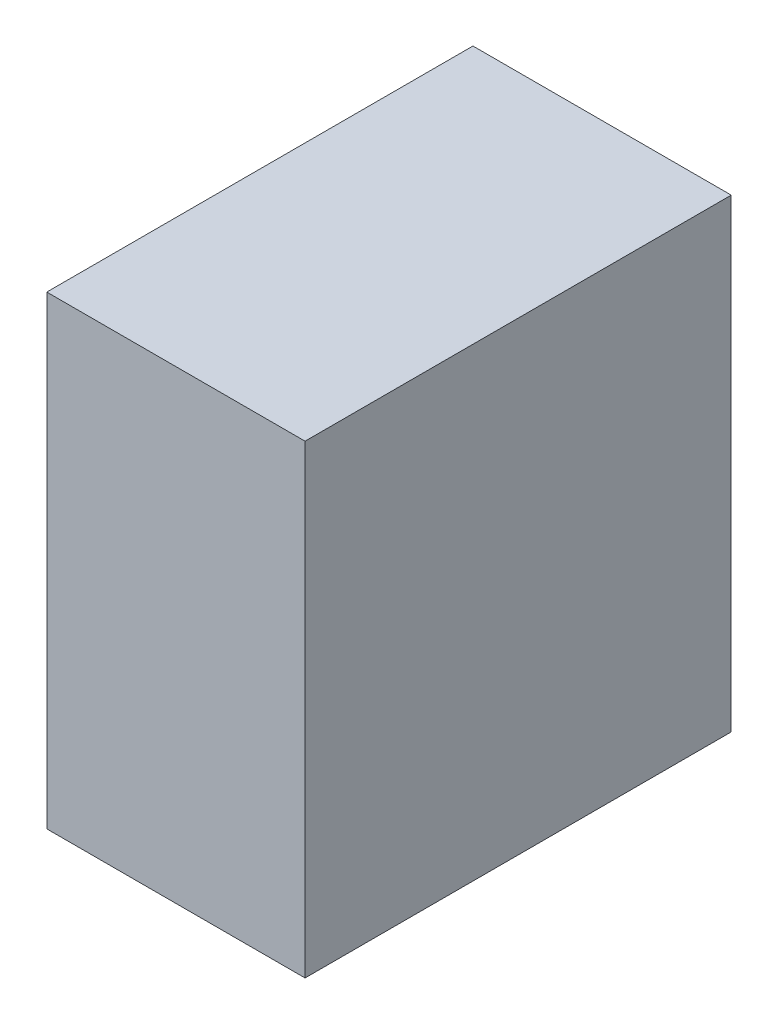
ISO-10303-21;
HEADER;
FILE_DESCRIPTION(('STEP AP214'),'2;1');
FILE_NAME('part.step','',(''),(''),'','','');
FILE_SCHEMA(('AUTOMOTIVE_DESIGN { 1 0 10303 214 1 1 1 1 }'));
ENDSEC;
DATA;
#1=APPLICATION_CONTEXT('core data for automotive mechanical design processes');
#2=APPLICATION_PROTOCOL_DEFINITION('international standard','automotive_design',2000,#1);
#3=PRODUCT_CONTEXT('',#1,'mechanical');
#4=PRODUCT('Part','Part','',(#3));
#5=PRODUCT_RELATED_PRODUCT_CATEGORY('part','',(#4));
#6=PRODUCT_DEFINITION_FORMATION('','',#4);
#7=PRODUCT_DEFINITION_CONTEXT('part definition',#1,'design');
#8=PRODUCT_DEFINITION('design','',#6,#7);
#9=PRODUCT_DEFINITION_SHAPE('','',#8);
#10=(LENGTH_UNIT() NAMED_UNIT(*) SI_UNIT(.MILLI.,.METRE.));
#11=(NAMED_UNIT(*) PLANE_ANGLE_UNIT() SI_UNIT($,.RADIAN.));
#12=(NAMED_UNIT(*) SI_UNIT($,.STERADIAN.) SOLID_ANGLE_UNIT());
#13=UNCERTAINTY_MEASURE_WITH_UNIT(LENGTH_MEASURE(1.E-05),#10,'distance_accuracy_value','');
#14=(GEOMETRIC_REPRESENTATION_CONTEXT(3) GLOBAL_UNCERTAINTY_ASSIGNED_CONTEXT((#13)) GLOBAL_UNIT_ASSIGNED_CONTEXT((#10,
#11,#12)) REPRESENTATION_CONTEXT('',''));
#15=CARTESIAN_POINT('',(0.,0.,0.));
#16=DIRECTION('',(0.,0.,1.));
#17=DIRECTION('',(1.,0.,0.));
#18=AXIS2_PLACEMENT_3D('',#15,#16,#17);
#19=CARTESIAN_POINT('',(-8.5,35.,15.));
#20=DIRECTION('',(0.,0.,-1.));
#21=DIRECTION('',(-1.,0.,0.));
#22=AXIS2_PLACEMENT_3D('',#19,#20,#21);
#23=PLANE('',#22);
#24=DIRECTION('',(0.,-1.,0.));
#25=VECTOR('',#24,1.);
#26=CARTESIAN_POINT('',(-3.5,37.5,15.));
#27=LINE('',#26,#25);
#28=CARTESIAN_POINT('',(-3.5,35.,15.));
#29=VERTEX_POINT('',#28);
#30=CARTESIAN_POINT('',(-3.5,0.,15.));
#31=VERTEX_POINT('',#30);
#32=EDGE_CURVE('E206',#29,#31,#27,.T.);
#33=ORIENTED_EDGE('',*,*,#32,.T.);
#34=DIRECTION('',(1.,0.,0.));
#35=VECTOR('',#34,1.);
#36=CARTESIAN_POINT('',(-8.5,0.,15.));
#37=LINE('',#36,#35);
#38=CARTESIAN_POINT('',(-8.5,0.,15.));
#39=VERTEX_POINT('',#38);
#40=EDGE_CURVE('E313',#39,#31,#37,.T.);
#41=ORIENTED_EDGE('',*,*,#40,.F.);
#42=DIRECTION('',(0.,-1.,0.));
#43=VECTOR('',#42,1.);
#44=CARTESIAN_POINT('',(-8.5,35.,15.));
#45=LINE('',#44,#43);
#46=CARTESIAN_POINT('',(-8.5,35.,15.));
#47=VERTEX_POINT('',#46);
#48=EDGE_CURVE('E341',#47,#39,#45,.T.);
#49=ORIENTED_EDGE('',*,*,#48,.F.);
#50=DIRECTION('',(1.,0.,0.));
#51=VECTOR('',#50,1.);
#52=CARTESIAN_POINT('',(-8.5,35.,15.));
#53=LINE('',#52,#51);
#54=EDGE_CURVE('E322',#47,#29,#53,.T.);
#55=ORIENTED_EDGE('',*,*,#54,.T.);
#56=EDGE_LOOP('',(#33,#41,#49,#55));
#57=FACE_BOUND('',#56,.T.);
#58=ADVANCED_FACE('F33',(#57),#23,.T.);
#59=DIRECTION('',(0.,-1.,0.));
#60=VECTOR('',#59,1.);
#61=CARTESIAN_POINT('',(3.50000000000001,37.5,15.));
#62=LINE('',#61,#60);
#63=CARTESIAN_POINT('',(3.50000000000001,35.,15.));
#64=VERTEX_POINT('',#63);
#65=CARTESIAN_POINT('',(3.50000000000001,0.,15.));
#66=VERTEX_POINT('',#65);
#67=EDGE_CURVE('E241',#64,#66,#62,.T.);
#68=ORIENTED_EDGE('',*,*,#67,.F.);
#69=CARTESIAN_POINT('',(8.5,35.,15.));
#70=VERTEX_POINT('',#69);
#71=EDGE_CURVE('E321',#64,#70,#53,.T.);
#72=ORIENTED_EDGE('',*,*,#71,.T.);
#73=DIRECTION('',(0.,-1.,0.));
#74=VECTOR('',#73,1.);
#75=CARTESIAN_POINT('',(8.5,35.,15.));
#76=LINE('',#75,#74);
#77=CARTESIAN_POINT('',(8.5,0.,15.));
#78=VERTEX_POINT('',#77);
#79=EDGE_CURVE('E324',#70,#78,#76,.T.);
#80=ORIENTED_EDGE('',*,*,#79,.T.);
#81=EDGE_CURVE('E335',#66,#78,#37,.T.);
#82=ORIENTED_EDGE('',*,*,#81,.F.);
#83=EDGE_LOOP('',(#68,#72,#80,#82));
#84=FACE_BOUND('',#83,.T.);
#85=ADVANCED_FACE('F390',(#84),#23,.T.);
#86=CARTESIAN_POINT('',(-8.5,35.,-15.));
#87=DIRECTION('',(0.,0.,1.));
#88=DIRECTION('',(1.,0.,0.));
#89=AXIS2_PLACEMENT_3D('',#86,#87,#88);
#90=PLANE('',#89);
#91=DIRECTION('',(0.,-1.,0.));
#92=VECTOR('',#91,1.);
#93=CARTESIAN_POINT('',(3.50000000000001,37.5,-15.));
#94=LINE('',#93,#92);
#95=CARTESIAN_POINT('',(3.50000000000001,35.,-15.));
#96=VERTEX_POINT('',#95);
#97=CARTESIAN_POINT('',(3.50000000000001,0.,-15.));
#98=VERTEX_POINT('',#97);
#99=EDGE_CURVE('E266',#96,#98,#94,.T.);
#100=ORIENTED_EDGE('',*,*,#99,.T.);
#101=DIRECTION('',(-1.,0.,0.));
#102=VECTOR('',#101,1.);
#103=CARTESIAN_POINT('',(-8.5,0.,-15.));
#104=LINE('',#103,#102);
#105=CARTESIAN_POINT('',(8.5,0.,-15.));
#106=VERTEX_POINT('',#105);
#107=EDGE_CURVE('E328',#106,#98,#104,.T.);
#108=ORIENTED_EDGE('',*,*,#107,.F.);
#109=DIRECTION('',(0.,-1.,0.));
#110=VECTOR('',#109,1.);
#111=CARTESIAN_POINT('',(8.5,35.,-15.));
#112=LINE('',#111,#110);
#113=CARTESIAN_POINT('',(8.5,35.,-15.));
#114=VERTEX_POINT('',#113);
#115=EDGE_CURVE('E346',#114,#106,#112,.T.);
#116=ORIENTED_EDGE('',*,*,#115,.F.);
#117=DIRECTION('',(-1.,0.,0.));
#118=VECTOR('',#117,1.);
#119=CARTESIAN_POINT('',(-8.5,35.,-15.));
#120=LINE('',#119,#118);
#121=EDGE_CURVE('E314',#114,#96,#120,.T.);
#122=ORIENTED_EDGE('',*,*,#121,.T.);
#123=EDGE_LOOP('',(#100,#108,#116,#122));
#124=FACE_BOUND('',#123,.T.);
#125=ADVANCED_FACE('F397',(#124),#90,.T.);
#126=DIRECTION('',(0.,-1.,0.));
#127=VECTOR('',#126,1.);
#128=CARTESIAN_POINT('',(-3.5,37.5,-15.));
#129=LINE('',#128,#127);
#130=CARTESIAN_POINT('',(-3.5,35.,-15.));
#131=VERTEX_POINT('',#130);
#132=CARTESIAN_POINT('',(-3.5,0.,-15.));
#133=VERTEX_POINT('',#132);
#134=EDGE_CURVE('E290',#131,#133,#129,.T.);
#135=ORIENTED_EDGE('',*,*,#134,.F.);
#136=CARTESIAN_POINT('',(-8.5,35.,-15.));
#137=VERTEX_POINT('',#136);
#138=EDGE_CURVE('E312',#131,#137,#120,.T.);
#139=ORIENTED_EDGE('',*,*,#138,.T.);
#140=DIRECTION('',(0.,-1.,0.));
#141=VECTOR('',#140,1.);
#142=CARTESIAN_POINT('',(-8.5,35.,-15.));
#143=LINE('',#142,#141);
#144=CARTESIAN_POINT('',(-8.5,0.,-15.));
#145=VERTEX_POINT('',#144);
#146=EDGE_CURVE('E343',#137,#145,#143,.T.);
#147=ORIENTED_EDGE('',*,*,#146,.T.);
#148=EDGE_CURVE('E327',#133,#145,#104,.T.);
#149=ORIENTED_EDGE('',*,*,#148,.F.);
#150=EDGE_LOOP('',(#135,#139,#147,#149));
#151=FACE_BOUND('',#150,.T.);
#152=ADVANCED_FACE('F556',(#151),#90,.T.);
#153=CARTESIAN_POINT('',(0.,0.,0.));
#154=DIRECTION('',(0.,1.,0.));
#155=DIRECTION('',(0.,0.,1.));
#156=AXIS2_PLACEMENT_3D('',#153,#154,#155);
#157=PLANE('',#156);
#158=DIRECTION('',(1.,0.,0.));
#159=VECTOR('',#158,1.);
#160=CARTESIAN_POINT('',(-10.,0.,16.5));
#161=LINE('',#160,#159);
#162=CARTESIAN_POINT('',(-10.,0.,16.5));
#163=VERTEX_POINT('',#162);
#164=CARTESIAN_POINT('',(10.,0.,16.5));
#165=VERTEX_POINT('',#164);
#166=EDGE_CURVE('E349',#163,#165,#161,.T.);
#167=ORIENTED_EDGE('',*,*,#166,.F.);
#168=DIRECTION('',(0.,0.,1.));
#169=VECTOR('',#168,1.);
#170=CARTESIAN_POINT('',(-10.,0.,16.5));
#171=LINE('',#170,#169);
#172=CARTESIAN_POINT('',(-9.99999999999999,0.,-16.5));
#173=VERTEX_POINT('',#172);
#174=EDGE_CURVE('E356',#173,#163,#171,.T.);
#175=ORIENTED_EDGE('',*,*,#174,.F.);
#176=DIRECTION('',(-1.,0.,0.));
#177=VECTOR('',#176,1.);
#178=CARTESIAN_POINT('',(-9.99999999999999,0.,-16.5));
#179=LINE('',#178,#177);
#180=CARTESIAN_POINT('',(10.,0.,-16.5));
#181=VERTEX_POINT('',#180);
#182=EDGE_CURVE('E354',#181,#173,#179,.T.);
#183=ORIENTED_EDGE('',*,*,#182,.F.);
#184=DIRECTION('',(0.,0.,-1.));
#185=VECTOR('',#184,1.);
#186=CARTESIAN_POINT('',(10.,0.,16.5));
#187=LINE('',#186,#185);
#188=EDGE_CURVE('E352',#165,#181,#187,.T.);
#189=ORIENTED_EDGE('',*,*,#188,.F.);
#190=EDGE_LOOP('',(#167,#175,#183,#189));
#191=FACE_BOUND('',#190,.T.);
#192=DIRECTION('',(0.,0.,-1.));
#193=VECTOR('',#192,1.);
#194=CARTESIAN_POINT('',(8.5,0.,15.));
#195=LINE('',#194,#193);
#196=EDGE_CURVE('E308',#78,#106,#195,.T.);
#197=ORIENTED_EDGE('',*,*,#196,.T.);
#198=ORIENTED_EDGE('',*,*,#107,.T.);
#199=DIRECTION('',(0.,0.,1.));
#200=VECTOR('',#199,1.);
#201=CARTESIAN_POINT('',(3.50000000000001,0.,-15.));
#202=LINE('',#201,#200);
#203=CARTESIAN_POINT('',(3.50000000000001,0.,-13.));
#204=VERTEX_POINT('',#203);
#205=EDGE_CURVE('E246',#98,#204,#202,.T.);
#206=ORIENTED_EDGE('',*,*,#205,.T.);
#207=DIRECTION('',(-1.,0.,0.));
#208=VECTOR('',#207,1.);
#209=CARTESIAN_POINT('',(2.00000000000001,0.,-13.));
#210=LINE('',#209,#208);
#211=CARTESIAN_POINT('',(2.00000000000001,0.,-13.));
#212=VERTEX_POINT('',#211);
#213=EDGE_CURVE('E251',#204,#212,#210,.T.);
#214=ORIENTED_EDGE('',*,*,#213,.T.);
#215=DIRECTION('',(0.,0.,-1.));
#216=VECTOR('',#215,1.);
#217=CARTESIAN_POINT('',(2.00000000000001,0.,-15.));
#218=LINE('',#217,#216);
#219=CARTESIAN_POINT('',(2.00000000000001,0.,-15.));
#220=VERTEX_POINT('',#219);
#221=EDGE_CURVE('E247',#212,#220,#218,.T.);
#222=ORIENTED_EDGE('',*,*,#221,.T.);
#223=CARTESIAN_POINT('',(-2.,0.,-15.));
#224=VERTEX_POINT('',#223);
#225=EDGE_CURVE('E332',#220,#224,#104,.T.);
#226=ORIENTED_EDGE('',*,*,#225,.T.);
#227=DIRECTION('',(0.,0.,1.));
#228=VECTOR('',#227,1.);
#229=CARTESIAN_POINT('',(-2.,0.,-15.));
#230=LINE('',#229,#228);
#231=CARTESIAN_POINT('',(-2.,0.,-13.));
#232=VERTEX_POINT('',#231);
#233=EDGE_CURVE('E271',#224,#232,#230,.T.);
#234=ORIENTED_EDGE('',*,*,#233,.T.);
#235=DIRECTION('',(-1.,0.,0.));
#236=VECTOR('',#235,1.);
#237=CARTESIAN_POINT('',(-2.,0.,-13.));
#238=LINE('',#237,#236);
#239=CARTESIAN_POINT('',(-3.5,0.,-13.));
#240=VERTEX_POINT('',#239);
#241=EDGE_CURVE('E276',#232,#240,#238,.T.);
#242=ORIENTED_EDGE('',*,*,#241,.T.);
#243=DIRECTION('',(0.,0.,-1.));
#244=VECTOR('',#243,1.);
#245=CARTESIAN_POINT('',(-3.5,0.,-15.));
#246=LINE('',#245,#244);
#247=EDGE_CURVE('E272',#240,#133,#246,.T.);
#248=ORIENTED_EDGE('',*,*,#247,.T.);
#249=ORIENTED_EDGE('',*,*,#148,.T.);
#250=DIRECTION('',(0.,0.,1.));
#251=VECTOR('',#250,1.);
#252=CARTESIAN_POINT('',(-8.5,0.,15.));
#253=LINE('',#252,#251);
#254=EDGE_CURVE('E331',#145,#39,#253,.T.);
#255=ORIENTED_EDGE('',*,*,#254,.T.);
#256=ORIENTED_EDGE('',*,*,#40,.T.);
#257=DIRECTION('',(0.,0.,-1.));
#258=VECTOR('',#257,1.);
#259=CARTESIAN_POINT('',(-3.5,0.,15.));
#260=LINE('',#259,#258);
#261=CARTESIAN_POINT('',(-3.5,0.,13.));
#262=VERTEX_POINT('',#261);
#263=EDGE_CURVE('E542',#31,#262,#260,.T.);
#264=ORIENTED_EDGE('',*,*,#263,.T.);
#265=DIRECTION('',(1.,0.,0.));
#266=VECTOR('',#265,1.);
#267=CARTESIAN_POINT('',(-2.,0.,13.));
#268=LINE('',#267,#266);
#269=CARTESIAN_POINT('',(-2.,0.,13.));
#270=VERTEX_POINT('',#269);
#271=EDGE_CURVE('E198',#262,#270,#268,.T.);
#272=ORIENTED_EDGE('',*,*,#271,.T.);
#273=DIRECTION('',(0.,0.,1.));
#274=VECTOR('',#273,1.);
#275=CARTESIAN_POINT('',(-2.,0.,15.));
#276=LINE('',#275,#274);
#277=CARTESIAN_POINT('',(-2.,0.,15.));
#278=VERTEX_POINT('',#277);
#279=EDGE_CURVE('E209',#270,#278,#276,.T.);
#280=ORIENTED_EDGE('',*,*,#279,.T.);
#281=CARTESIAN_POINT('',(2.00000000000001,0.,15.));
#282=VERTEX_POINT('',#281);
#283=EDGE_CURVE('E338',#278,#282,#37,.T.);
#284=ORIENTED_EDGE('',*,*,#283,.T.);
#285=DIRECTION('',(0.,0.,-1.));
#286=VECTOR('',#285,1.);
#287=CARTESIAN_POINT('',(2.00000000000001,0.,15.));
#288=LINE('',#287,#286);
#289=CARTESIAN_POINT('',(2.00000000000001,0.,13.));
#290=VERTEX_POINT('',#289);
#291=EDGE_CURVE('E222',#282,#290,#288,.T.);
#292=ORIENTED_EDGE('',*,*,#291,.T.);
#293=DIRECTION('',(1.,0.,0.));
#294=VECTOR('',#293,1.);
#295=CARTESIAN_POINT('',(2.00000000000001,0.,13.));
#296=LINE('',#295,#294);
#297=CARTESIAN_POINT('',(3.50000000000001,0.,13.));
#298=VERTEX_POINT('',#297);
#299=EDGE_CURVE('E227',#290,#298,#296,.T.);
#300=ORIENTED_EDGE('',*,*,#299,.T.);
#301=DIRECTION('',(0.,0.,1.));
#302=VECTOR('',#301,1.);
#303=CARTESIAN_POINT('',(3.50000000000001,0.,15.));
#304=LINE('',#303,#302);
#305=EDGE_CURVE('E223',#298,#66,#304,.T.);
#306=ORIENTED_EDGE('',*,*,#305,.T.);
#307=ORIENTED_EDGE('',*,*,#81,.T.);
#308=EDGE_LOOP('',(#197,#198,#206,#214,#222,#226,#234,#242,#248,#249,#255,#256,#264,#272,#280,
#284,#292,#300,#306,#307));
#309=FACE_BOUND('',#308,.T.);
#310=ADVANCED_FACE('F373',(#191,#309),#157,.F.);
#311=CARTESIAN_POINT('',(-10.,35.,16.5));
#312=DIRECTION('',(0.,0.,-1.));
#313=DIRECTION('',(-1.,0.,0.));
#314=AXIS2_PLACEMENT_3D('',#311,#312,#313);
#315=PLANE('',#314);
#316=ORIENTED_EDGE('',*,*,#166,.T.);
#317=DIRECTION('',(0.,-1.,0.));
#318=VECTOR('',#317,1.);
#319=CARTESIAN_POINT('',(10.,35.,16.5));
#320=LINE('',#319,#318);
#321=CARTESIAN_POINT('',(10.,36.,16.5));
#322=VERTEX_POINT('',#321);
#323=EDGE_CURVE('E11',#322,#165,#320,.T.);
#324=ORIENTED_EDGE('',*,*,#323,.F.);
#325=DIRECTION('',(1.,0.,0.));
#326=VECTOR('',#325,1.);
#327=CARTESIAN_POINT('',(-10.,36.,16.5));
#328=LINE('',#327,#326);
#329=CARTESIAN_POINT('',(-10.,36.,16.5));
#330=VERTEX_POINT('',#329);
#331=EDGE_CURVE('E299',#330,#322,#328,.T.);
#332=ORIENTED_EDGE('',*,*,#331,.F.);
#333=DIRECTION('',(0.,-1.,0.));
#334=VECTOR('',#333,1.);
#335=CARTESIAN_POINT('',(-10.,35.,16.5));
#336=LINE('',#335,#334);
#337=EDGE_CURVE('E358',#330,#163,#336,.T.);
#338=ORIENTED_EDGE('',*,*,#337,.T.);
#339=EDGE_LOOP('',(#316,#324,#332,#338));
#340=FACE_BOUND('',#339,.T.);
#341=ADVANCED_FACE('F35',(#340),#315,.F.);
#342=CARTESIAN_POINT('',(10.,35.,16.5));
#343=DIRECTION('',(-1.,0.,0.));
#344=DIRECTION('',(0.,0.,1.));
#345=AXIS2_PLACEMENT_3D('',#342,#343,#344);
#346=PLANE('',#345);
#347=ORIENTED_EDGE('',*,*,#188,.T.);
#348=DIRECTION('',(0.,-1.,0.));
#349=VECTOR('',#348,1.);
#350=CARTESIAN_POINT('',(10.,35.,-16.5));
#351=LINE('',#350,#349);
#352=CARTESIAN_POINT('',(10.,36.,-16.5));
#353=VERTEX_POINT('',#352);
#354=EDGE_CURVE('E41',#353,#181,#351,.T.);
#355=ORIENTED_EDGE('',*,*,#354,.F.);
#356=DIRECTION('',(0.,0.,-1.));
#357=VECTOR('',#356,1.);
#358=CARTESIAN_POINT('',(10.,36.,16.5));
#359=LINE('',#358,#357);
#360=EDGE_CURVE('E302',#322,#353,#359,.T.);
#361=ORIENTED_EDGE('',*,*,#360,.F.);
#362=ORIENTED_EDGE('',*,*,#323,.T.);
#363=EDGE_LOOP('',(#347,#355,#361,#362));
#364=FACE_BOUND('',#363,.T.);
#365=ADVANCED_FACE('F382',(#364),#346,.F.);
#366=CARTESIAN_POINT('',(-9.99999999999999,35.,-16.5));
#367=DIRECTION('',(0.,0.,1.));
#368=DIRECTION('',(1.,0.,0.));
#369=AXIS2_PLACEMENT_3D('',#366,#367,#368);
#370=PLANE('',#369);
#371=ORIENTED_EDGE('',*,*,#182,.T.);
#372=DIRECTION('',(0.,-1.,0.));
#373=VECTOR('',#372,1.);
#374=CARTESIAN_POINT('',(-9.99999999999999,35.,-16.5));
#375=LINE('',#374,#373);
#376=CARTESIAN_POINT('',(-9.99999999999999,36.,-16.5));
#377=VERTEX_POINT('',#376);
#378=EDGE_CURVE('E361',#377,#173,#375,.T.);
#379=ORIENTED_EDGE('',*,*,#378,.F.);
#380=DIRECTION('',(-1.,0.,0.));
#381=VECTOR('',#380,1.);
#382=CARTESIAN_POINT('',(10.,36.,-16.5));
#383=LINE('',#382,#381);
#384=EDGE_CURVE('E305',#353,#377,#383,.T.);
#385=ORIENTED_EDGE('',*,*,#384,.F.);
#386=ORIENTED_EDGE('',*,*,#354,.T.);
#387=EDGE_LOOP('',(#371,#379,#385,#386));
#388=FACE_BOUND('',#387,.T.);
#389=ADVANCED_FACE('F367',(#388),#370,.F.);
#390=CARTESIAN_POINT('',(-10.,35.,16.5));
#391=DIRECTION('',(1.,0.,0.));
#392=DIRECTION('',(0.,0.,-1.));
#393=AXIS2_PLACEMENT_3D('',#390,#391,#392);
#394=PLANE('',#393);
#395=ORIENTED_EDGE('',*,*,#174,.T.);
#396=ORIENTED_EDGE('',*,*,#337,.F.);
#397=DIRECTION('',(0.,0.,1.));
#398=VECTOR('',#397,1.);
#399=CARTESIAN_POINT('',(-9.99999999999999,36.,-16.5));
#400=LINE('',#399,#398);
#401=EDGE_CURVE('E296',#377,#330,#400,.T.);
#402=ORIENTED_EDGE('',*,*,#401,.F.);
#403=ORIENTED_EDGE('',*,*,#378,.T.);
#404=EDGE_LOOP('',(#395,#396,#402,#403));
#405=FACE_BOUND('',#404,.T.);
#406=ADVANCED_FACE('F376',(#405),#394,.F.);
#407=CARTESIAN_POINT('',(8.5,35.,15.));
#408=DIRECTION('',(-1.,0.,0.));
#409=DIRECTION('',(0.,0.,1.));
#410=AXIS2_PLACEMENT_3D('',#407,#408,#409);
#411=PLANE('',#410);
#412=ORIENTED_EDGE('',*,*,#196,.F.);
#413=ORIENTED_EDGE('',*,*,#79,.F.);
#414=DIRECTION('',(0.,0.,-1.));
#415=VECTOR('',#414,1.);
#416=CARTESIAN_POINT('',(8.5,35.,15.));
#417=LINE('',#416,#415);
#418=EDGE_CURVE('E309',#70,#114,#417,.T.);
#419=ORIENTED_EDGE('',*,*,#418,.T.);
#420=ORIENTED_EDGE('',*,*,#115,.T.);
#421=EDGE_LOOP('',(#412,#413,#419,#420));
#422=FACE_BOUND('',#421,.T.);
#423=ADVANCED_FACE('F425',(#422),#411,.T.);
#424=DIRECTION('',(0.,-1.,0.));
#425=VECTOR('',#424,1.);
#426=CARTESIAN_POINT('',(2.00000000000001,37.5,-15.));
#427=LINE('',#426,#425);
#428=CARTESIAN_POINT('',(2.00000000000001,35.,-15.));
#429=VERTEX_POINT('',#428);
#430=EDGE_CURVE('E261',#429,#220,#427,.T.);
#431=ORIENTED_EDGE('',*,*,#430,.F.);
#432=CARTESIAN_POINT('',(-2.,35.,-15.));
#433=VERTEX_POINT('',#432);
#434=EDGE_CURVE('E318',#429,#433,#120,.T.);
#435=ORIENTED_EDGE('',*,*,#434,.T.);
#436=DIRECTION('',(0.,-1.,0.));
#437=VECTOR('',#436,1.);
#438=CARTESIAN_POINT('',(-2.,37.5,-15.));
#439=LINE('',#438,#437);
#440=EDGE_CURVE('E287',#433,#224,#439,.T.);
#441=ORIENTED_EDGE('',*,*,#440,.T.);
#442=ORIENTED_EDGE('',*,*,#225,.F.);
#443=EDGE_LOOP('',(#431,#435,#441,#442));
#444=FACE_BOUND('',#443,.T.);
#445=ADVANCED_FACE('F407',(#444),#90,.T.);
#446=CARTESIAN_POINT('',(-8.5,35.,15.));
#447=DIRECTION('',(1.,0.,0.));
#448=DIRECTION('',(0.,0.,-1.));
#449=AXIS2_PLACEMENT_3D('',#446,#447,#448);
#450=PLANE('',#449);
#451=ORIENTED_EDGE('',*,*,#254,.F.);
#452=ORIENTED_EDGE('',*,*,#146,.F.);
#453=DIRECTION('',(0.,0.,1.));
#454=VECTOR('',#453,1.);
#455=CARTESIAN_POINT('',(-8.5,35.,15.));
#456=LINE('',#455,#454);
#457=EDGE_CURVE('E317',#137,#47,#456,.T.);
#458=ORIENTED_EDGE('',*,*,#457,.T.);
#459=ORIENTED_EDGE('',*,*,#48,.T.);
#460=EDGE_LOOP('',(#451,#452,#458,#459));
#461=FACE_BOUND('',#460,.T.);
#462=ADVANCED_FACE('F402',(#461),#450,.T.);
#463=DIRECTION('',(0.,-1.,0.));
#464=VECTOR('',#463,1.);
#465=CARTESIAN_POINT('',(-2.,37.5,15.));
#466=LINE('',#465,#464);
#467=CARTESIAN_POINT('',(-2.,35.,15.));
#468=VERTEX_POINT('',#467);
#469=EDGE_CURVE('E219',#468,#278,#466,.T.);
#470=ORIENTED_EDGE('',*,*,#469,.F.);
#471=CARTESIAN_POINT('',(2.00000000000001,35.,15.));
#472=VERTEX_POINT('',#471);
#473=EDGE_CURVE('E56',#468,#472,#53,.T.);
#474=ORIENTED_EDGE('',*,*,#473,.T.);
#475=DIRECTION('',(0.,-1.,0.));
#476=VECTOR('',#475,1.);
#477=CARTESIAN_POINT('',(2.00000000000001,37.5,15.));
#478=LINE('',#477,#476);
#479=EDGE_CURVE('E238',#472,#282,#478,.T.);
#480=ORIENTED_EDGE('',*,*,#479,.T.);
#481=ORIENTED_EDGE('',*,*,#283,.F.);
#482=EDGE_LOOP('',(#470,#474,#480,#481));
#483=FACE_BOUND('',#482,.T.);
#484=ADVANCED_FACE('F393',(#483),#23,.T.);
#485=CARTESIAN_POINT('',(0.,35.,0.));
#486=DIRECTION('',(0.,1.,0.));
#487=DIRECTION('',(0.,0.,1.));
#488=AXIS2_PLACEMENT_3D('',#485,#486,#487);
#489=PLANE('',#488);
#490=DIRECTION('',(1.,0.,0.));
#491=VECTOR('',#490,1.);
#492=CARTESIAN_POINT('',(-2.,35.,13.));
#493=LINE('',#492,#491);
#494=CARTESIAN_POINT('',(-3.5,35.,13.));
#495=VERTEX_POINT('',#494);
#496=CARTESIAN_POINT('',(-2.,35.,13.));
#497=VERTEX_POINT('',#496);
#498=EDGE_CURVE('E48',#495,#497,#493,.T.);
#499=ORIENTED_EDGE('',*,*,#498,.F.);
#500=DIRECTION('',(0.,0.,-1.));
#501=VECTOR('',#500,1.);
#502=CARTESIAN_POINT('',(-3.5,35.,15.));
#503=LINE('',#502,#501);
#504=EDGE_CURVE('E201',#29,#495,#503,.T.);
#505=ORIENTED_EDGE('',*,*,#504,.F.);
#506=ORIENTED_EDGE('',*,*,#54,.F.);
#507=ORIENTED_EDGE('',*,*,#457,.F.);
#508=ORIENTED_EDGE('',*,*,#138,.F.);
#509=DIRECTION('',(0.,0.,-1.));
#510=VECTOR('',#509,1.);
#511=CARTESIAN_POINT('',(-3.5,35.,-15.));
#512=LINE('',#511,#510);
#513=CARTESIAN_POINT('',(-3.5,35.,-13.));
#514=VERTEX_POINT('',#513);
#515=EDGE_CURVE('E288',#514,#131,#512,.T.);
#516=ORIENTED_EDGE('',*,*,#515,.F.);
#517=DIRECTION('',(-1.,0.,0.));
#518=VECTOR('',#517,1.);
#519=CARTESIAN_POINT('',(-2.,35.,-13.));
#520=LINE('',#519,#518);
#521=CARTESIAN_POINT('',(-2.,35.,-13.));
#522=VERTEX_POINT('',#521);
#523=EDGE_CURVE('E275',#522,#514,#520,.T.);
#524=ORIENTED_EDGE('',*,*,#523,.F.);
#525=DIRECTION('',(0.,0.,1.));
#526=VECTOR('',#525,1.);
#527=CARTESIAN_POINT('',(-2.,35.,-15.));
#528=LINE('',#527,#526);
#529=EDGE_CURVE('E284',#433,#522,#528,.T.);
#530=ORIENTED_EDGE('',*,*,#529,.F.);
#531=ORIENTED_EDGE('',*,*,#434,.F.);
#532=DIRECTION('',(0.,0.,-1.));
#533=VECTOR('',#532,1.);
#534=CARTESIAN_POINT('',(2.00000000000001,35.,-15.));
#535=LINE('',#534,#533);
#536=CARTESIAN_POINT('',(2.00000000000001,35.,-13.));
#537=VERTEX_POINT('',#536);
#538=EDGE_CURVE('E259',#537,#429,#535,.T.);
#539=ORIENTED_EDGE('',*,*,#538,.F.);
#540=DIRECTION('',(-1.,0.,0.));
#541=VECTOR('',#540,1.);
#542=CARTESIAN_POINT('',(2.00000000000001,35.,-13.));
#543=LINE('',#542,#541);
#544=CARTESIAN_POINT('',(3.50000000000001,35.,-13.));
#545=VERTEX_POINT('',#544);
#546=EDGE_CURVE('E263',#545,#537,#543,.T.);
#547=ORIENTED_EDGE('',*,*,#546,.F.);
#548=DIRECTION('',(0.,0.,1.));
#549=VECTOR('',#548,1.);
#550=CARTESIAN_POINT('',(3.50000000000001,35.,-15.));
#551=LINE('',#550,#549);
#552=EDGE_CURVE('E250',#96,#545,#551,.T.);
#553=ORIENTED_EDGE('',*,*,#552,.F.);
#554=ORIENTED_EDGE('',*,*,#121,.F.);
#555=ORIENTED_EDGE('',*,*,#418,.F.);
#556=ORIENTED_EDGE('',*,*,#71,.F.);
#557=DIRECTION('',(0.,0.,1.));
#558=VECTOR('',#557,1.);
#559=CARTESIAN_POINT('',(3.50000000000001,35.,15.));
#560=LINE('',#559,#558);
#561=CARTESIAN_POINT('',(3.50000000000001,35.,13.));
#562=VERTEX_POINT('',#561);
#563=EDGE_CURVE('E239',#562,#64,#560,.T.);
#564=ORIENTED_EDGE('',*,*,#563,.F.);
#565=DIRECTION('',(1.,0.,0.));
#566=VECTOR('',#565,1.);
#567=CARTESIAN_POINT('',(2.00000000000001,35.,13.));
#568=LINE('',#567,#566);
#569=CARTESIAN_POINT('',(2.00000000000001,35.,13.));
#570=VERTEX_POINT('',#569);
#571=EDGE_CURVE('E226',#570,#562,#568,.T.);
#572=ORIENTED_EDGE('',*,*,#571,.F.);
#573=DIRECTION('',(0.,0.,-1.));
#574=VECTOR('',#573,1.);
#575=CARTESIAN_POINT('',(2.00000000000001,35.,15.));
#576=LINE('',#575,#574);
#577=EDGE_CURVE('E235',#472,#570,#576,.T.);
#578=ORIENTED_EDGE('',*,*,#577,.F.);
#579=ORIENTED_EDGE('',*,*,#473,.F.);
#580=DIRECTION('',(0.,0.,1.));
#581=VECTOR('',#580,1.);
#582=CARTESIAN_POINT('',(-2.,35.,15.));
#583=LINE('',#582,#581);
#584=EDGE_CURVE('E213',#497,#468,#583,.T.);
#585=ORIENTED_EDGE('',*,*,#584,.F.);
#586=EDGE_LOOP('',(#499,#505,#506,#507,#508,#516,#524,#530,#531,#539,#547,#553,#554,#555,#556,
#564,#572,#578,#579,#585));
#587=FACE_BOUND('',#586,.T.);
#588=ADVANCED_FACE('F212',(#587),#489,.F.);
#589=CARTESIAN_POINT('',(0.,36.,0.));
#590=DIRECTION('',(0.,1.,0.));
#591=DIRECTION('',(0.,0.,1.));
#592=AXIS2_PLACEMENT_3D('',#589,#590,#591);
#593=PLANE('',#592);
#594=ORIENTED_EDGE('',*,*,#401,.T.);
#595=ORIENTED_EDGE('',*,*,#331,.T.);
#596=ORIENTED_EDGE('',*,*,#360,.T.);
#597=ORIENTED_EDGE('',*,*,#384,.T.);
#598=EDGE_LOOP('',(#594,#595,#596,#597));
#599=FACE_BOUND('',#598,.T.);
#600=ADVANCED_FACE('F381',(#599),#593,.T.);
#601=CARTESIAN_POINT('',(-2.,37.5,-13.));
#602=DIRECTION('',(0.,0.,1.));
#603=DIRECTION('',(1.,0.,0.));
#604=AXIS2_PLACEMENT_3D('',#601,#602,#603);
#605=PLANE('',#604);
#606=DIRECTION('',(0.,-1.,0.));
#607=VECTOR('',#606,1.);
#608=CARTESIAN_POINT('',(-2.,37.5,-13.));
#609=LINE('',#608,#607);
#610=EDGE_CURVE('E286',#522,#232,#609,.T.);
#611=ORIENTED_EDGE('',*,*,#610,.F.);
#612=ORIENTED_EDGE('',*,*,#523,.T.);
#613=DIRECTION('',(0.,-1.,0.));
#614=VECTOR('',#613,1.);
#615=CARTESIAN_POINT('',(-3.5,37.5,-13.));
#616=LINE('',#615,#614);
#617=EDGE_CURVE('E283',#514,#240,#616,.T.);
#618=ORIENTED_EDGE('',*,*,#617,.T.);
#619=ORIENTED_EDGE('',*,*,#241,.F.);
#620=EDGE_LOOP('',(#611,#612,#618,#619));
#621=FACE_BOUND('',#620,.T.);
#622=ADVANCED_FACE('F465',(#621),#605,.T.);
#623=CARTESIAN_POINT('',(-3.5,37.5,-15.));
#624=DIRECTION('',(-1.,0.,0.));
#625=DIRECTION('',(0.,0.,1.));
#626=AXIS2_PLACEMENT_3D('',#623,#624,#625);
#627=PLANE('',#626);
#628=ORIENTED_EDGE('',*,*,#617,.F.);
#629=ORIENTED_EDGE('',*,*,#515,.T.);
#630=ORIENTED_EDGE('',*,*,#134,.T.);
#631=ORIENTED_EDGE('',*,*,#247,.F.);
#632=EDGE_LOOP('',(#628,#629,#630,#631));
#633=FACE_BOUND('',#632,.T.);
#634=ADVANCED_FACE('F461',(#633),#627,.T.);
#635=CARTESIAN_POINT('',(-2.,37.5,-15.));
#636=DIRECTION('',(1.,0.,0.));
#637=DIRECTION('',(0.,0.,-1.));
#638=AXIS2_PLACEMENT_3D('',#635,#636,#637);
#639=PLANE('',#638);
#640=ORIENTED_EDGE('',*,*,#440,.F.);
#641=ORIENTED_EDGE('',*,*,#529,.T.);
#642=ORIENTED_EDGE('',*,*,#610,.T.);
#643=ORIENTED_EDGE('',*,*,#233,.F.);
#644=EDGE_LOOP('',(#640,#641,#642,#643));
#645=FACE_BOUND('',#644,.T.);
#646=ADVANCED_FACE('F457',(#645),#639,.T.);
#647=CARTESIAN_POINT('',(3.50000000000001,37.5,-15.));
#648=DIRECTION('',(1.,0.,0.));
#649=DIRECTION('',(0.,0.,-1.));
#650=AXIS2_PLACEMENT_3D('',#647,#648,#649);
#651=PLANE('',#650);
#652=ORIENTED_EDGE('',*,*,#99,.F.);
#653=ORIENTED_EDGE('',*,*,#552,.T.);
#654=DIRECTION('',(0.,-1.,0.));
#655=VECTOR('',#654,1.);
#656=CARTESIAN_POINT('',(3.50000000000001,37.5,-13.));
#657=LINE('',#656,#655);
#658=EDGE_CURVE('E258',#545,#204,#657,.T.);
#659=ORIENTED_EDGE('',*,*,#658,.T.);
#660=ORIENTED_EDGE('',*,*,#205,.F.);
#661=EDGE_LOOP('',(#652,#653,#659,#660));
#662=FACE_BOUND('',#661,.T.);
#663=ADVANCED_FACE('F453',(#662),#651,.T.);
#664=CARTESIAN_POINT('',(2.00000000000001,37.5,-13.));
#665=DIRECTION('',(0.,0.,1.));
#666=DIRECTION('',(1.,0.,0.));
#667=AXIS2_PLACEMENT_3D('',#664,#665,#666);
#668=PLANE('',#667);
#669=ORIENTED_EDGE('',*,*,#658,.F.);
#670=ORIENTED_EDGE('',*,*,#546,.T.);
#671=DIRECTION('',(0.,-1.,0.));
#672=VECTOR('',#671,1.);
#673=CARTESIAN_POINT('',(2.00000000000001,37.5,-13.));
#674=LINE('',#673,#672);
#675=EDGE_CURVE('E262',#537,#212,#674,.T.);
#676=ORIENTED_EDGE('',*,*,#675,.T.);
#677=ORIENTED_EDGE('',*,*,#213,.F.);
#678=EDGE_LOOP('',(#669,#670,#676,#677));
#679=FACE_BOUND('',#678,.T.);
#680=ADVANCED_FACE('F449',(#679),#668,.T.);
#681=CARTESIAN_POINT('',(2.00000000000001,37.5,-15.));
#682=DIRECTION('',(-1.,0.,0.));
#683=DIRECTION('',(0.,0.,1.));
#684=AXIS2_PLACEMENT_3D('',#681,#682,#683);
#685=PLANE('',#684);
#686=ORIENTED_EDGE('',*,*,#675,.F.);
#687=ORIENTED_EDGE('',*,*,#538,.T.);
#688=ORIENTED_EDGE('',*,*,#430,.T.);
#689=ORIENTED_EDGE('',*,*,#221,.F.);
#690=EDGE_LOOP('',(#686,#687,#688,#689));
#691=FACE_BOUND('',#690,.T.);
#692=ADVANCED_FACE('F443',(#691),#685,.T.);
#693=CARTESIAN_POINT('',(2.00000000000001,37.5,13.));
#694=DIRECTION('',(0.,0.,-1.));
#695=DIRECTION('',(-1.,0.,0.));
#696=AXIS2_PLACEMENT_3D('',#693,#694,#695);
#697=PLANE('',#696);
#698=DIRECTION('',(0.,-1.,0.));
#699=VECTOR('',#698,1.);
#700=CARTESIAN_POINT('',(2.00000000000001,37.5,13.));
#701=LINE('',#700,#699);
#702=EDGE_CURVE('E237',#570,#290,#701,.T.);
#703=ORIENTED_EDGE('',*,*,#702,.F.);
#704=ORIENTED_EDGE('',*,*,#571,.T.);
#705=DIRECTION('',(0.,-1.,0.));
#706=VECTOR('',#705,1.);
#707=CARTESIAN_POINT('',(3.50000000000001,37.5,13.));
#708=LINE('',#707,#706);
#709=EDGE_CURVE('E234',#562,#298,#708,.T.);
#710=ORIENTED_EDGE('',*,*,#709,.T.);
#711=ORIENTED_EDGE('',*,*,#299,.F.);
#712=EDGE_LOOP('',(#703,#704,#710,#711));
#713=FACE_BOUND('',#712,.T.);
#714=ADVANCED_FACE('F433',(#713),#697,.T.);
#715=CARTESIAN_POINT('',(3.50000000000001,37.5,15.));
#716=DIRECTION('',(1.,0.,0.));
#717=DIRECTION('',(0.,0.,-1.));
#718=AXIS2_PLACEMENT_3D('',#715,#716,#717);
#719=PLANE('',#718);
#720=ORIENTED_EDGE('',*,*,#709,.F.);
#721=ORIENTED_EDGE('',*,*,#563,.T.);
#722=ORIENTED_EDGE('',*,*,#67,.T.);
#723=ORIENTED_EDGE('',*,*,#305,.F.);
#724=EDGE_LOOP('',(#720,#721,#722,#723));
#725=FACE_BOUND('',#724,.T.);
#726=ADVANCED_FACE('F435',(#725),#719,.T.);
#727=CARTESIAN_POINT('',(2.00000000000001,37.5,15.));
#728=DIRECTION('',(-1.,0.,0.));
#729=DIRECTION('',(0.,0.,1.));
#730=AXIS2_PLACEMENT_3D('',#727,#728,#729);
#731=PLANE('',#730);
#732=ORIENTED_EDGE('',*,*,#479,.F.);
#733=ORIENTED_EDGE('',*,*,#577,.T.);
#734=ORIENTED_EDGE('',*,*,#702,.T.);
#735=ORIENTED_EDGE('',*,*,#291,.F.);
#736=EDGE_LOOP('',(#732,#733,#734,#735));
#737=FACE_BOUND('',#736,.T.);
#738=ADVANCED_FACE('F429',(#737),#731,.T.);
#739=CARTESIAN_POINT('',(-3.5,37.5,15.));
#740=DIRECTION('',(-1.,0.,0.));
#741=DIRECTION('',(0.,0.,1.));
#742=AXIS2_PLACEMENT_3D('',#739,#740,#741);
#743=PLANE('',#742);
#744=ORIENTED_EDGE('',*,*,#32,.F.);
#745=ORIENTED_EDGE('',*,*,#504,.T.);
#746=DIRECTION('',(0.,-1.,0.));
#747=VECTOR('',#746,1.);
#748=CARTESIAN_POINT('',(-3.5,37.5,13.));
#749=LINE('',#748,#747);
#750=EDGE_CURVE('E194',#495,#262,#749,.T.);
#751=ORIENTED_EDGE('',*,*,#750,.T.);
#752=ORIENTED_EDGE('',*,*,#263,.F.);
#753=EDGE_LOOP('',(#744,#745,#751,#752));
#754=FACE_BOUND('',#753,.T.);
#755=ADVANCED_FACE('F204',(#754),#743,.T.);
#756=CARTESIAN_POINT('',(-2.,37.5,13.));
#757=DIRECTION('',(0.,0.,-1.));
#758=DIRECTION('',(-1.,0.,0.));
#759=AXIS2_PLACEMENT_3D('',#756,#757,#758);
#760=PLANE('',#759);
#761=ORIENTED_EDGE('',*,*,#750,.F.);
#762=ORIENTED_EDGE('',*,*,#498,.T.);
#763=DIRECTION('',(0.,-1.,0.));
#764=VECTOR('',#763,1.);
#765=CARTESIAN_POINT('',(-2.,37.5,13.));
#766=LINE('',#765,#764);
#767=EDGE_CURVE('E214',#497,#270,#766,.T.);
#768=ORIENTED_EDGE('',*,*,#767,.T.);
#769=ORIENTED_EDGE('',*,*,#271,.F.);
#770=EDGE_LOOP('',(#761,#762,#768,#769));
#771=FACE_BOUND('',#770,.T.);
#772=ADVANCED_FACE('F196',(#771),#760,.T.);
#773=CARTESIAN_POINT('',(-2.,37.5,15.));
#774=DIRECTION('',(1.,0.,0.));
#775=DIRECTION('',(0.,0.,-1.));
#776=AXIS2_PLACEMENT_3D('',#773,#774,#775);
#777=PLANE('',#776);
#778=ORIENTED_EDGE('',*,*,#767,.F.);
#779=ORIENTED_EDGE('',*,*,#584,.T.);
#780=ORIENTED_EDGE('',*,*,#469,.T.);
#781=ORIENTED_EDGE('',*,*,#279,.F.);
#782=EDGE_LOOP('',(#778,#779,#780,#781));
#783=FACE_BOUND('',#782,.T.);
#784=ADVANCED_FACE('F530',(#783),#777,.T.);
#785=CLOSED_SHELL('',(#58,#85,#125,#152,#310,#341,#365,#389,#406,#423,#445,#462,#484,#588,#600,
#622,#634,#646,#663,#680,#692,#714,#726,#738,#755,#772,#784));
#786=MANIFOLD_SOLID_BREP('B2',#785);
#787=ADVANCED_BREP_SHAPE_REPRESENTATION('',(#18,#786),#14);
#788=SHAPE_DEFINITION_REPRESENTATION(#9,#787);
ENDSEC;
END-ISO-10303-21;
